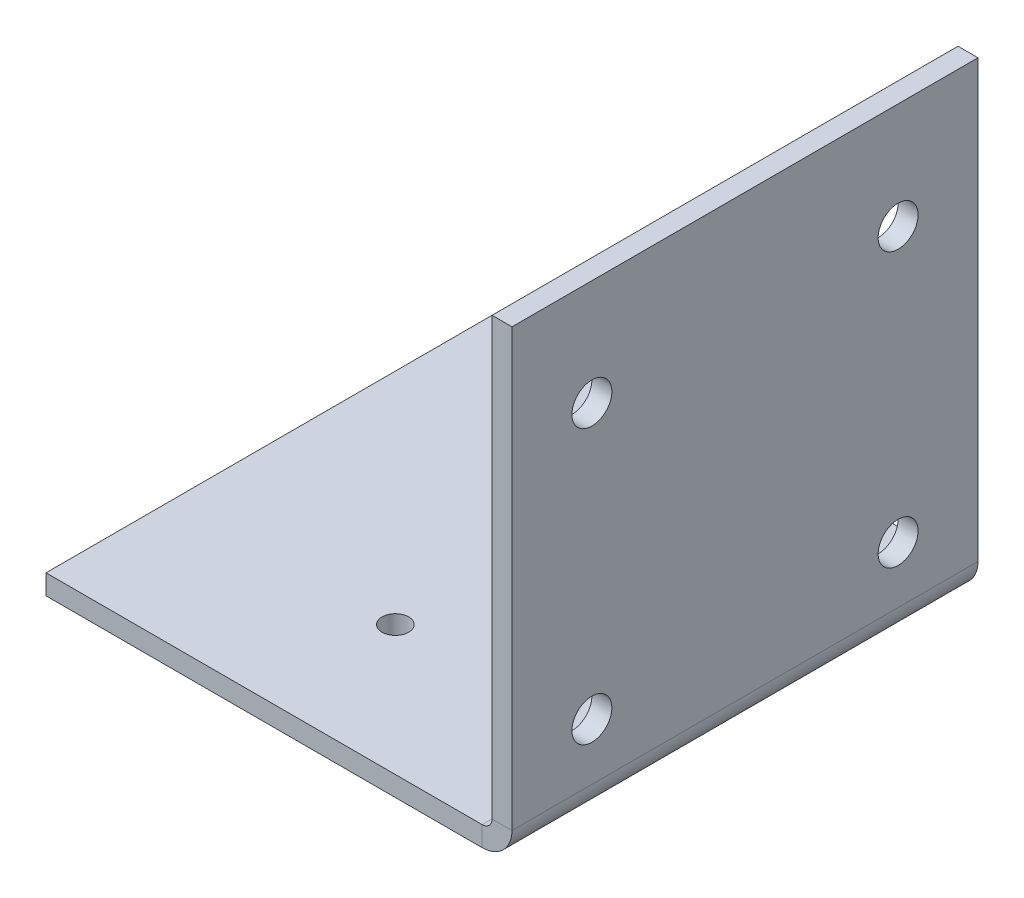
ISO-10303-21;
HEADER;
FILE_DESCRIPTION(('STEP AP214'),'2;1');
FILE_NAME('part.step','',(''),(''),'','','');
FILE_SCHEMA(('AUTOMOTIVE_DESIGN { 1 0 10303 214 1 1 1 1 }'));
ENDSEC;
DATA;
#1=APPLICATION_CONTEXT('core data for automotive mechanical design processes');
#2=APPLICATION_PROTOCOL_DEFINITION('international standard','automotive_design',2000,#1);
#3=PRODUCT_CONTEXT('',#1,'mechanical');
#4=PRODUCT('Part','Part','',(#3));
#5=PRODUCT_RELATED_PRODUCT_CATEGORY('part','',(#4));
#6=PRODUCT_DEFINITION_FORMATION('','',#4);
#7=PRODUCT_DEFINITION_CONTEXT('part definition',#1,'design');
#8=PRODUCT_DEFINITION('design','',#6,#7);
#9=PRODUCT_DEFINITION_SHAPE('','',#8);
#10=(LENGTH_UNIT() NAMED_UNIT(*) SI_UNIT(.MILLI.,.METRE.));
#11=(NAMED_UNIT(*) PLANE_ANGLE_UNIT() SI_UNIT($,.RADIAN.));
#12=(NAMED_UNIT(*) SI_UNIT($,.STERADIAN.) SOLID_ANGLE_UNIT());
#13=UNCERTAINTY_MEASURE_WITH_UNIT(LENGTH_MEASURE(1.E-05),#10,'distance_accuracy_value','');
#14=(GEOMETRIC_REPRESENTATION_CONTEXT(3) GLOBAL_UNCERTAINTY_ASSIGNED_CONTEXT((#13)) GLOBAL_UNIT_ASSIGNED_CONTEXT((#10,
#11,#12)) REPRESENTATION_CONTEXT('',''));
#15=CARTESIAN_POINT('',(0.,0.,0.));
#16=DIRECTION('',(0.,0.,1.));
#17=DIRECTION('',(1.,0.,0.));
#18=AXIS2_PLACEMENT_3D('',#15,#16,#17);
#19=CARTESIAN_POINT('',(-79.,13.600921455939,17.5));
#20=DIRECTION('',(0.,0.,-1.));
#21=DIRECTION('',(-1.,0.,0.));
#22=AXIS2_PLACEMENT_3D('',#19,#20,#21);
#23=PLANE('',#22);
#24=DIRECTION('',(0.,-1.,0.));
#25=VECTOR('',#24,1.);
#26=CARTESIAN_POINT('',(-81.2366,13.600921455939,17.5));
#27=LINE('',#26,#25);
#28=CARTESIAN_POINT('',(-81.2366,13.600921455939,17.5));
#29=VERTEX_POINT('',#28);
#30=CARTESIAN_POINT('',(-81.2366,12.100921455939,17.5));
#31=VERTEX_POINT('',#30);
#32=EDGE_CURVE('E115',#29,#31,#27,.T.);
#33=ORIENTED_EDGE('',*,*,#32,.F.);
#34=DIRECTION('',(1.,0.,0.));
#35=VECTOR('',#34,1.);
#36=CARTESIAN_POINT('',(-79.,13.600921455939,17.5));
#37=LINE('',#36,#35);
#38=CARTESIAN_POINT('',(-114.,13.600921455939,17.5));
#39=VERTEX_POINT('',#38);
#40=EDGE_CURVE('E121',#39,#29,#37,.T.);
#41=ORIENTED_EDGE('',*,*,#40,.F.);
#42=DIRECTION('',(0.,-1.,0.));
#43=VECTOR('',#42,1.);
#44=CARTESIAN_POINT('',(-114.,13.600921455939,17.5));
#45=LINE('',#44,#43);
#46=CARTESIAN_POINT('',(-114.,12.100921455939,17.5));
#47=VERTEX_POINT('',#46);
#48=EDGE_CURVE('E13',#39,#47,#45,.T.);
#49=ORIENTED_EDGE('',*,*,#48,.T.);
#50=DIRECTION('',(1.,0.,0.));
#51=VECTOR('',#50,1.);
#52=CARTESIAN_POINT('',(-79.,12.100921455939,17.5));
#53=LINE('',#52,#51);
#54=EDGE_CURVE('E107',#47,#31,#53,.T.);
#55=ORIENTED_EDGE('',*,*,#54,.T.);
#56=EDGE_LOOP('',(#33,#41,#49,#55));
#57=FACE_BOUND('',#56,.T.);
#58=ADVANCED_FACE('F59',(#57),#23,.F.);
#59=CARTESIAN_POINT('',(-79.,13.600921455939,-17.5));
#60=DIRECTION('',(0.,0.,1.));
#61=DIRECTION('',(1.,0.,0.));
#62=AXIS2_PLACEMENT_3D('',#59,#60,#61);
#63=PLANE('',#62);
#64=DIRECTION('',(0.,-1.,0.));
#65=VECTOR('',#64,1.);
#66=CARTESIAN_POINT('',(-81.2366,13.600921455939,-17.5));
#67=LINE('',#66,#65);
#68=CARTESIAN_POINT('',(-81.2366,13.600921455939,-17.5));
#69=VERTEX_POINT('',#68);
#70=CARTESIAN_POINT('',(-81.2366,12.100921455939,-17.5));
#71=VERTEX_POINT('',#70);
#72=EDGE_CURVE('E102',#69,#71,#67,.T.);
#73=ORIENTED_EDGE('',*,*,#72,.T.);
#74=DIRECTION('',(-1.,0.,0.));
#75=VECTOR('',#74,1.);
#76=CARTESIAN_POINT('',(-79.,12.100921455939,-17.5));
#77=LINE('',#76,#75);
#78=CARTESIAN_POINT('',(-114.,12.100921455939,-17.5));
#79=VERTEX_POINT('',#78);
#80=EDGE_CURVE('E97',#71,#79,#77,.T.);
#81=ORIENTED_EDGE('',*,*,#80,.T.);
#82=DIRECTION('',(0.,-1.,0.));
#83=VECTOR('',#82,1.);
#84=CARTESIAN_POINT('',(-114.,13.600921455939,-17.5));
#85=LINE('',#84,#83);
#86=CARTESIAN_POINT('',(-114.,13.600921455939,-17.5));
#87=VERTEX_POINT('',#86);
#88=EDGE_CURVE('E67',#87,#79,#85,.T.);
#89=ORIENTED_EDGE('',*,*,#88,.F.);
#90=DIRECTION('',(-1.,0.,0.));
#91=VECTOR('',#90,1.);
#92=CARTESIAN_POINT('',(-79.,13.600921455939,-17.5));
#93=LINE('',#92,#91);
#94=EDGE_CURVE('E83',#69,#87,#93,.T.);
#95=ORIENTED_EDGE('',*,*,#94,.F.);
#96=EDGE_LOOP('',(#73,#81,#89,#95));
#97=FACE_BOUND('',#96,.T.);
#98=ADVANCED_FACE('F99',(#97),#63,.F.);
#99=CARTESIAN_POINT('',(0.,13.600921455939,0.));
#100=DIRECTION('',(0.,-1.,0.));
#101=DIRECTION('',(0.,0.,-1.));
#102=AXIS2_PLACEMENT_3D('',#99,#100,#101);
#103=PLANE('',#102);
#104=CARTESIAN_POINT('',(-97.5126074749339,13.600921455939,-7.747));
#105=DIRECTION('',(0.,-1.,0.));
#106=DIRECTION('',(0.,0.,-1.));
#107=AXIS2_PLACEMENT_3D('',#104,#105,#106);
#108=CIRCLE('',#107,0.999999999999998);
#109=CARTESIAN_POINT('',(-97.5126074749339,13.600921455939,-8.747));
#110=VERTEX_POINT('',#109);
#111=EDGE_CURVE('E190',#110,#110,#108,.F.);
#112=ORIENTED_EDGE('',*,*,#111,.F.);
#113=EDGE_LOOP('',(#112));
#114=FACE_BOUND('',#113,.T.);
#115=CARTESIAN_POINT('',(-97.5126074749339,13.600921455939,7.747));
#116=DIRECTION('',(0.,-1.,0.));
#117=DIRECTION('',(0.,0.,-1.));
#118=AXIS2_PLACEMENT_3D('',#115,#116,#117);
#119=CIRCLE('',#118,0.999999999999998);
#120=CARTESIAN_POINT('',(-97.5126074749339,13.600921455939,6.747));
#121=VERTEX_POINT('',#120);
#122=EDGE_CURVE('E201',#121,#121,#119,.F.);
#123=ORIENTED_EDGE('',*,*,#122,.F.);
#124=EDGE_LOOP('',(#123));
#125=FACE_BOUND('',#124,.T.);
#126=DIRECTION('',(0.,0.,-1.));
#127=VECTOR('',#126,1.);
#128=CARTESIAN_POINT('',(-81.2366,13.600921455939,-17.5));
#129=LINE('',#128,#127);
#130=EDGE_CURVE('E129',#69,#29,#129,.F.);
#131=ORIENTED_EDGE('',*,*,#130,.F.);
#132=ORIENTED_EDGE('',*,*,#94,.T.);
#133=DIRECTION('',(0.,0.,1.));
#134=VECTOR('',#133,1.);
#135=CARTESIAN_POINT('',(-114.,13.600921455939,-17.5));
#136=LINE('',#135,#134);
#137=EDGE_CURVE('E106',#87,#39,#136,.T.);
#138=ORIENTED_EDGE('',*,*,#137,.T.);
#139=ORIENTED_EDGE('',*,*,#40,.T.);
#140=EDGE_LOOP('',(#131,#132,#138,#139));
#141=FACE_BOUND('',#140,.T.);
#142=ADVANCED_FACE('F218',(#114,#125,#141),#103,.F.);
#143=CARTESIAN_POINT('',(0.,12.100921455939,0.));
#144=DIRECTION('',(0.,-1.,0.));
#145=DIRECTION('',(0.,0.,-1.));
#146=AXIS2_PLACEMENT_3D('',#143,#144,#145);
#147=PLANE('',#146);
#148=CARTESIAN_POINT('',(-97.5126074749339,12.100921455939,-7.747));
#149=DIRECTION('',(0.,-1.,0.));
#150=DIRECTION('',(0.,0.,-1.));
#151=AXIS2_PLACEMENT_3D('',#148,#149,#150);
#152=CIRCLE('',#151,0.999999999999998);
#153=CARTESIAN_POINT('',(-97.5126074749339,12.100921455939,-8.747));
#154=VERTEX_POINT('',#153);
#155=EDGE_CURVE('E204',#154,#154,#152,.T.);
#156=ORIENTED_EDGE('',*,*,#155,.F.);
#157=EDGE_LOOP('',(#156));
#158=FACE_BOUND('',#157,.T.);
#159=CARTESIAN_POINT('',(-97.5126074749339,12.100921455939,7.747));
#160=DIRECTION('',(0.,-1.,0.));
#161=DIRECTION('',(0.,0.,-1.));
#162=AXIS2_PLACEMENT_3D('',#159,#160,#161);
#163=CIRCLE('',#162,0.999999999999998);
#164=CARTESIAN_POINT('',(-97.5126074749339,12.100921455939,6.747));
#165=VERTEX_POINT('',#164);
#166=EDGE_CURVE('E205',#165,#165,#163,.T.);
#167=ORIENTED_EDGE('',*,*,#166,.F.);
#168=EDGE_LOOP('',(#167));
#169=FACE_BOUND('',#168,.T.);
#170=ORIENTED_EDGE('',*,*,#80,.F.);
#171=DIRECTION('',(0.,0.,-1.));
#172=VECTOR('',#171,1.);
#173=CARTESIAN_POINT('',(-81.2366,12.100921455939,-17.5));
#174=LINE('',#173,#172);
#175=EDGE_CURVE('E139',#71,#31,#174,.F.);
#176=ORIENTED_EDGE('',*,*,#175,.T.);
#177=ORIENTED_EDGE('',*,*,#54,.F.);
#178=DIRECTION('',(0.,0.,1.));
#179=VECTOR('',#178,1.);
#180=CARTESIAN_POINT('',(-114.,12.100921455939,-17.5));
#181=LINE('',#180,#179);
#182=EDGE_CURVE('E112',#79,#47,#181,.T.);
#183=ORIENTED_EDGE('',*,*,#182,.F.);
#184=EDGE_LOOP('',(#170,#176,#177,#183));
#185=FACE_BOUND('',#184,.T.);
#186=ADVANCED_FACE('F113',(#158,#169,#185),#147,.T.);
#187=CARTESIAN_POINT('',(-114.,13.600921455939,-17.5));
#188=DIRECTION('',(1.,0.,0.));
#189=DIRECTION('',(0.,0.,-1.));
#190=AXIS2_PLACEMENT_3D('',#187,#188,#189);
#191=PLANE('',#190);
#192=ORIENTED_EDGE('',*,*,#182,.T.);
#193=ORIENTED_EDGE('',*,*,#48,.F.);
#194=ORIENTED_EDGE('',*,*,#137,.F.);
#195=ORIENTED_EDGE('',*,*,#88,.T.);
#196=EDGE_LOOP('',(#192,#193,#194,#195));
#197=FACE_BOUND('',#196,.T.);
#198=ADVANCED_FACE('F61',(#197),#191,.F.);
#199=CARTESIAN_POINT('',(-81.2366,14.337521455939,17.5));
#200=DIRECTION('',(0.,0.,1.));
#201=DIRECTION('',(1.,0.,0.));
#202=AXIS2_PLACEMENT_3D('',#199,#200,#201);
#203=PLANE('',#202);
#204=DIRECTION('',(-1.,0.,0.));
#205=VECTOR('',#204,1.);
#206=CARTESIAN_POINT('',(-79.,14.337521455939,17.5));
#207=LINE('',#206,#205);
#208=CARTESIAN_POINT('',(-80.5,14.337521455939,17.5));
#209=VERTEX_POINT('',#208);
#210=CARTESIAN_POINT('',(-79.,14.337521455939,17.5));
#211=VERTEX_POINT('',#210);
#212=EDGE_CURVE('E142',#209,#211,#207,.F.);
#213=ORIENTED_EDGE('',*,*,#212,.F.);
#214=CARTESIAN_POINT('',(-81.2366,14.337521455939,17.5));
#215=DIRECTION('',(0.,0.,-1.));
#216=DIRECTION('',(-1.,0.,0.));
#217=AXIS2_PLACEMENT_3D('',#214,#215,#216);
#218=CIRCLE('',#217,0.736600000000004);
#219=EDGE_CURVE('E133',#29,#209,#218,.F.);
#220=ORIENTED_EDGE('',*,*,#219,.F.);
#221=ORIENTED_EDGE('',*,*,#32,.T.);
#222=CARTESIAN_POINT('',(-81.2366,14.337521455939,17.5));
#223=DIRECTION('',(0.,0.,-1.));
#224=DIRECTION('',(-1.,0.,0.));
#225=AXIS2_PLACEMENT_3D('',#222,#223,#224);
#226=CIRCLE('',#225,2.2366);
#227=EDGE_CURVE('E74',#31,#211,#226,.F.);
#228=ORIENTED_EDGE('',*,*,#227,.T.);
#229=EDGE_LOOP('',(#213,#220,#221,#228));
#230=FACE_BOUND('',#229,.T.);
#231=ADVANCED_FACE('F247',(#230),#203,.T.);
#232=CARTESIAN_POINT('',(-81.2366,14.337521455939,-17.5));
#233=DIRECTION('',(0.,0.,1.));
#234=DIRECTION('',(1.,0.,0.));
#235=AXIS2_PLACEMENT_3D('',#232,#233,#234);
#236=PLANE('',#235);
#237=CARTESIAN_POINT('',(-81.2366,14.337521455939,-17.5));
#238=DIRECTION('',(0.,0.,-1.));
#239=DIRECTION('',(-1.,0.,0.));
#240=AXIS2_PLACEMENT_3D('',#237,#238,#239);
#241=CIRCLE('',#240,0.736600000000004);
#242=CARTESIAN_POINT('',(-80.5,14.337521455939,-17.5));
#243=VERTEX_POINT('',#242);
#244=EDGE_CURVE('E126',#243,#69,#241,.T.);
#245=ORIENTED_EDGE('',*,*,#244,.F.);
#246=DIRECTION('',(-1.,0.,0.));
#247=VECTOR('',#246,1.);
#248=CARTESIAN_POINT('',(-80.5,14.337521455939,-17.5));
#249=LINE('',#248,#247);
#250=CARTESIAN_POINT('',(-79.,14.337521455939,-17.5));
#251=VERTEX_POINT('',#250);
#252=EDGE_CURVE('E149',#243,#251,#249,.F.);
#253=ORIENTED_EDGE('',*,*,#252,.T.);
#254=CARTESIAN_POINT('',(-81.2366,14.337521455939,-17.5));
#255=DIRECTION('',(0.,0.,-1.));
#256=DIRECTION('',(-1.,0.,0.));
#257=AXIS2_PLACEMENT_3D('',#254,#255,#256);
#258=CIRCLE('',#257,2.2366);
#259=EDGE_CURVE('E136',#251,#71,#258,.T.);
#260=ORIENTED_EDGE('',*,*,#259,.T.);
#261=ORIENTED_EDGE('',*,*,#72,.F.);
#262=EDGE_LOOP('',(#245,#253,#260,#261));
#263=FACE_BOUND('',#262,.T.);
#264=ADVANCED_FACE('F255',(#263),#236,.F.);
#265=CARTESIAN_POINT('',(-81.2366,14.337521455939,-17.5));
#266=DIRECTION('',(0.,0.,-1.));
#267=DIRECTION('',(1.,0.,0.));
#268=AXIS2_PLACEMENT_3D('',#265,#266,#267);
#269=CYLINDRICAL_SURFACE('',#268,2.2366);
#270=ORIENTED_EDGE('',*,*,#175,.F.);
#271=ORIENTED_EDGE('',*,*,#259,.F.);
#272=DIRECTION('',(0.,0.,-1.));
#273=VECTOR('',#272,1.);
#274=CARTESIAN_POINT('',(-79.,14.337521455939,17.5));
#275=LINE('',#274,#273);
#276=EDGE_CURVE('E152',#251,#211,#275,.F.);
#277=ORIENTED_EDGE('',*,*,#276,.T.);
#278=ORIENTED_EDGE('',*,*,#227,.F.);
#279=EDGE_LOOP('',(#270,#271,#277,#278));
#280=FACE_BOUND('',#279,.T.);
#281=ADVANCED_FACE('F258',(#280),#269,.T.);
#282=CARTESIAN_POINT('',(-81.2366,14.337521455939,-17.5));
#283=DIRECTION('',(0.,0.,-1.));
#284=DIRECTION('',(1.,0.,0.));
#285=AXIS2_PLACEMENT_3D('',#282,#283,#284);
#286=CYLINDRICAL_SURFACE('',#285,0.736600000000004);
#287=ORIENTED_EDGE('',*,*,#130,.T.);
#288=ORIENTED_EDGE('',*,*,#219,.T.);
#289=DIRECTION('',(0.,0.,-1.));
#290=VECTOR('',#289,1.);
#291=CARTESIAN_POINT('',(-80.5,14.337521455939,17.5));
#292=LINE('',#291,#290);
#293=EDGE_CURVE('E145',#209,#243,#292,.T.);
#294=ORIENTED_EDGE('',*,*,#293,.T.);
#295=ORIENTED_EDGE('',*,*,#244,.T.);
#296=EDGE_LOOP('',(#287,#288,#294,#295));
#297=FACE_BOUND('',#296,.T.);
#298=ADVANCED_FACE('F238',(#297),#286,.F.);
#299=CARTESIAN_POINT('',(-78.9999999999999,47.100921455939,-17.5));
#300=DIRECTION('',(0.,0.,1.));
#301=DIRECTION('',(1.,0.,0.));
#302=AXIS2_PLACEMENT_3D('',#299,#300,#301);
#303=PLANE('',#302);
#304=ORIENTED_EDGE('',*,*,#252,.F.);
#305=DIRECTION('',(0.,-1.,0.));
#306=VECTOR('',#305,1.);
#307=CARTESIAN_POINT('',(-80.4999999999999,47.100921455939,-17.5));
#308=LINE('',#307,#306);
#309=CARTESIAN_POINT('',(-80.4999999999999,47.100921455939,-17.5));
#310=VERTEX_POINT('',#309);
#311=EDGE_CURVE('E154',#243,#310,#308,.F.);
#312=ORIENTED_EDGE('',*,*,#311,.T.);
#313=DIRECTION('',(-1.,0.,0.));
#314=VECTOR('',#313,1.);
#315=CARTESIAN_POINT('',(-78.9999999999999,47.100921455939,-17.5));
#316=LINE('',#315,#314);
#317=CARTESIAN_POINT('',(-78.9999999999999,47.100921455939,-17.5));
#318=VERTEX_POINT('',#317);
#319=EDGE_CURVE('E130',#318,#310,#316,.T.);
#320=ORIENTED_EDGE('',*,*,#319,.F.);
#321=DIRECTION('',(0.,1.,0.));
#322=VECTOR('',#321,1.);
#323=CARTESIAN_POINT('',(-79.,2.56576565888414E-13,-17.5));
#324=LINE('',#323,#322);
#325=EDGE_CURVE('E163',#251,#318,#324,.T.);
#326=ORIENTED_EDGE('',*,*,#325,.F.);
#327=EDGE_LOOP('',(#304,#312,#320,#326));
#328=FACE_BOUND('',#327,.T.);
#329=ADVANCED_FACE('F264',(#328),#303,.F.);
#330=CARTESIAN_POINT('',(-79.,13.600921455939,17.5));
#331=DIRECTION('',(0.,0.,-1.));
#332=DIRECTION('',(-1.,0.,0.));
#333=AXIS2_PLACEMENT_3D('',#330,#331,#332);
#334=PLANE('',#333);
#335=ORIENTED_EDGE('',*,*,#212,.T.);
#336=DIRECTION('',(0.,-1.,0.));
#337=VECTOR('',#336,1.);
#338=CARTESIAN_POINT('',(-79.,2.56576565888414E-13,17.5));
#339=LINE('',#338,#337);
#340=CARTESIAN_POINT('',(-78.9999999999999,47.100921455939,17.5));
#341=VERTEX_POINT('',#340);
#342=EDGE_CURVE('E169',#341,#211,#339,.T.);
#343=ORIENTED_EDGE('',*,*,#342,.F.);
#344=DIRECTION('',(-1.,0.,0.));
#345=VECTOR('',#344,1.);
#346=CARTESIAN_POINT('',(-78.9999999999999,47.100921455939,17.5));
#347=LINE('',#346,#345);
#348=CARTESIAN_POINT('',(-80.4999999999999,47.100921455939,17.5));
#349=VERTEX_POINT('',#348);
#350=EDGE_CURVE('E172',#341,#349,#347,.T.);
#351=ORIENTED_EDGE('',*,*,#350,.T.);
#352=DIRECTION('',(0.,1.,0.));
#353=VECTOR('',#352,1.);
#354=CARTESIAN_POINT('',(-80.5,13.600921455939,17.5));
#355=LINE('',#354,#353);
#356=EDGE_CURVE('E160',#349,#209,#355,.F.);
#357=ORIENTED_EDGE('',*,*,#356,.T.);
#358=EDGE_LOOP('',(#335,#343,#351,#357));
#359=FACE_BOUND('',#358,.T.);
#360=ADVANCED_FACE('F269',(#359),#334,.F.);
#361=CARTESIAN_POINT('',(-79.,2.56576565888414E-13,0.));
#362=DIRECTION('',(-1.,0.,0.));
#363=DIRECTION('',(0.,-1.,0.));
#364=AXIS2_PLACEMENT_3D('',#361,#362,#363);
#365=PLANE('',#364);
#366=CARTESIAN_POINT('',(-79.,18.5789021772819,-11.5));
#367=DIRECTION('',(-1.,0.,0.));
#368=DIRECTION('',(0.,-1.,0.));
#369=AXIS2_PLACEMENT_3D('',#366,#367,#368);
#370=CIRCLE('',#369,1.5);
#371=CARTESIAN_POINT('',(-79.,17.0789021772819,-11.5));
#372=VERTEX_POINT('',#371);
#373=EDGE_CURVE('E183',#372,#372,#370,.F.);
#374=ORIENTED_EDGE('',*,*,#373,.F.);
#375=EDGE_LOOP('',(#374));
#376=FACE_BOUND('',#375,.T.);
#377=CARTESIAN_POINT('',(-79.,18.5789021772819,11.5));
#378=DIRECTION('',(-1.,0.,0.));
#379=DIRECTION('',(0.,-1.,0.));
#380=AXIS2_PLACEMENT_3D('',#377,#378,#379);
#381=CIRCLE('',#380,1.5);
#382=CARTESIAN_POINT('',(-79.,17.0789021772819,11.5));
#383=VERTEX_POINT('',#382);
#384=EDGE_CURVE('E191',#383,#383,#381,.F.);
#385=ORIENTED_EDGE('',*,*,#384,.F.);
#386=EDGE_LOOP('',(#385));
#387=FACE_BOUND('',#386,.T.);
#388=CARTESIAN_POINT('',(-78.9999999999999,39.1450000000001,11.5));
#389=DIRECTION('',(-1.,0.,0.));
#390=DIRECTION('',(0.,-1.,0.));
#391=AXIS2_PLACEMENT_3D('',#388,#389,#390);
#392=CIRCLE('',#391,1.5);
#393=CARTESIAN_POINT('',(-78.9999999999999,37.6450000000001,11.5));
#394=VERTEX_POINT('',#393);
#395=EDGE_CURVE('E182',#394,#394,#392,.F.);
#396=ORIENTED_EDGE('',*,*,#395,.F.);
#397=EDGE_LOOP('',(#396));
#398=FACE_BOUND('',#397,.T.);
#399=CARTESIAN_POINT('',(-78.9999999999999,39.1450000000001,-11.5));
#400=DIRECTION('',(-1.,0.,0.));
#401=DIRECTION('',(0.,-1.,0.));
#402=AXIS2_PLACEMENT_3D('',#399,#400,#401);
#403=CIRCLE('',#402,1.5);
#404=CARTESIAN_POINT('',(-78.9999999999999,37.6450000000001,-11.5));
#405=VERTEX_POINT('',#404);
#406=EDGE_CURVE('E146',#405,#405,#403,.F.);
#407=ORIENTED_EDGE('',*,*,#406,.F.);
#408=EDGE_LOOP('',(#407));
#409=FACE_BOUND('',#408,.T.);
#410=ORIENTED_EDGE('',*,*,#276,.F.);
#411=ORIENTED_EDGE('',*,*,#325,.T.);
#412=DIRECTION('',(0.,0.,1.));
#413=VECTOR('',#412,1.);
#414=CARTESIAN_POINT('',(-78.9999999999999,47.100921455939,0.));
#415=LINE('',#414,#413);
#416=EDGE_CURVE('E166',#318,#341,#415,.T.);
#417=ORIENTED_EDGE('',*,*,#416,.T.);
#418=ORIENTED_EDGE('',*,*,#342,.T.);
#419=EDGE_LOOP('',(#410,#411,#417,#418));
#420=FACE_BOUND('',#419,.T.);
#421=ADVANCED_FACE('F279',(#376,#387,#398,#409,#420),#365,.F.);
#422=CARTESIAN_POINT('',(-80.5,2.61813787896679E-13,0.));
#423=DIRECTION('',(-1.,0.,0.));
#424=DIRECTION('',(0.,-1.,0.));
#425=AXIS2_PLACEMENT_3D('',#422,#423,#424);
#426=PLANE('',#425);
#427=CARTESIAN_POINT('',(-80.5,18.5789021772819,-11.5));
#428=DIRECTION('',(-1.,0.,0.));
#429=DIRECTION('',(0.,1.,0.));
#430=AXIS2_PLACEMENT_3D('',#427,#428,#429);
#431=CIRCLE('',#430,1.5);
#432=CARTESIAN_POINT('',(-80.5,20.0789021772819,-11.5));
#433=VERTEX_POINT('',#432);
#434=EDGE_CURVE('E187',#433,#433,#431,.T.);
#435=ORIENTED_EDGE('',*,*,#434,.F.);
#436=EDGE_LOOP('',(#435));
#437=FACE_BOUND('',#436,.T.);
#438=CARTESIAN_POINT('',(-80.5,18.5789021772819,11.5));
#439=DIRECTION('',(-1.,0.,0.));
#440=DIRECTION('',(0.,-1.,0.));
#441=AXIS2_PLACEMENT_3D('',#438,#439,#440);
#442=CIRCLE('',#441,1.5);
#443=CARTESIAN_POINT('',(-80.5,17.0789021772819,11.5));
#444=VERTEX_POINT('',#443);
#445=EDGE_CURVE('E186',#444,#444,#442,.T.);
#446=ORIENTED_EDGE('',*,*,#445,.F.);
#447=EDGE_LOOP('',(#446));
#448=FACE_BOUND('',#447,.T.);
#449=CARTESIAN_POINT('',(-80.4999999999999,39.1450000000001,11.5));
#450=DIRECTION('',(-1.,0.,0.));
#451=DIRECTION('',(0.,1.,0.));
#452=AXIS2_PLACEMENT_3D('',#449,#450,#451);
#453=CIRCLE('',#452,1.5);
#454=CARTESIAN_POINT('',(-80.4999999999999,40.6450000000001,11.5));
#455=VERTEX_POINT('',#454);
#456=EDGE_CURVE('E194',#455,#455,#453,.T.);
#457=ORIENTED_EDGE('',*,*,#456,.F.);
#458=EDGE_LOOP('',(#457));
#459=FACE_BOUND('',#458,.T.);
#460=CARTESIAN_POINT('',(-80.4999999999999,39.1450000000001,-11.5));
#461=DIRECTION('',(-1.,0.,0.));
#462=DIRECTION('',(0.,-1.,0.));
#463=AXIS2_PLACEMENT_3D('',#460,#461,#462);
#464=CIRCLE('',#463,1.5);
#465=CARTESIAN_POINT('',(-80.4999999999999,37.6450000000001,-11.5));
#466=VERTEX_POINT('',#465);
#467=EDGE_CURVE('E179',#466,#466,#464,.T.);
#468=ORIENTED_EDGE('',*,*,#467,.F.);
#469=EDGE_LOOP('',(#468));
#470=FACE_BOUND('',#469,.T.);
#471=ORIENTED_EDGE('',*,*,#311,.F.);
#472=ORIENTED_EDGE('',*,*,#293,.F.);
#473=ORIENTED_EDGE('',*,*,#356,.F.);
#474=DIRECTION('',(0.,0.,-1.));
#475=VECTOR('',#474,1.);
#476=CARTESIAN_POINT('',(-80.4999999999999,47.100921455939,17.5));
#477=LINE('',#476,#475);
#478=EDGE_CURVE('E157',#310,#349,#477,.F.);
#479=ORIENTED_EDGE('',*,*,#478,.F.);
#480=EDGE_LOOP('',(#471,#472,#473,#479));
#481=FACE_BOUND('',#480,.T.);
#482=ADVANCED_FACE('F275',(#437,#448,#459,#470,#481),#426,.T.);
#483=CARTESIAN_POINT('',(-78.9999999999999,47.100921455939,17.5));
#484=DIRECTION('',(0.,-1.,0.));
#485=DIRECTION('',(1.,0.,0.));
#486=AXIS2_PLACEMENT_3D('',#483,#484,#485);
#487=PLANE('',#486);
#488=ORIENTED_EDGE('',*,*,#478,.T.);
#489=ORIENTED_EDGE('',*,*,#350,.F.);
#490=ORIENTED_EDGE('',*,*,#416,.F.);
#491=ORIENTED_EDGE('',*,*,#319,.T.);
#492=EDGE_LOOP('',(#488,#489,#490,#491));
#493=FACE_BOUND('',#492,.T.);
#494=ADVANCED_FACE('F271',(#493),#487,.F.);
#495=CARTESIAN_POINT('',(-78.9989999999998,39.1450000000001,-11.5));
#496=DIRECTION('',(-1.,0.,0.));
#497=DIRECTION('',(0.,-1.,0.));
#498=AXIS2_PLACEMENT_3D('',#495,#496,#497);
#499=CYLINDRICAL_SURFACE('',#498,1.5);
#500=ORIENTED_EDGE('',*,*,#467,.T.);
#501=EDGE_LOOP('',(#500));
#502=FACE_BOUND('',#501,.T.);
#503=ORIENTED_EDGE('',*,*,#406,.T.);
#504=EDGE_LOOP('',(#503));
#505=FACE_BOUND('',#504,.T.);
#506=ADVANCED_FACE('F274',(#502,#505),#499,.F.);
#507=CARTESIAN_POINT('',(-78.9989999999998,39.1450000000001,11.5));
#508=DIRECTION('',(-1.,0.,0.));
#509=DIRECTION('',(0.,-1.,0.));
#510=AXIS2_PLACEMENT_3D('',#507,#508,#509);
#511=CYLINDRICAL_SURFACE('',#510,1.5);
#512=ORIENTED_EDGE('',*,*,#456,.T.);
#513=EDGE_LOOP('',(#512));
#514=FACE_BOUND('',#513,.T.);
#515=ORIENTED_EDGE('',*,*,#395,.T.);
#516=EDGE_LOOP('',(#515));
#517=FACE_BOUND('',#516,.T.);
#518=ADVANCED_FACE('F289',(#514,#517),#511,.F.);
#519=CARTESIAN_POINT('',(-78.9989999999999,18.5789021772819,11.5));
#520=DIRECTION('',(-1.,0.,0.));
#521=DIRECTION('',(0.,-1.,0.));
#522=AXIS2_PLACEMENT_3D('',#519,#520,#521);
#523=CYLINDRICAL_SURFACE('',#522,1.5);
#524=ORIENTED_EDGE('',*,*,#445,.T.);
#525=EDGE_LOOP('',(#524));
#526=FACE_BOUND('',#525,.T.);
#527=ORIENTED_EDGE('',*,*,#384,.T.);
#528=EDGE_LOOP('',(#527));
#529=FACE_BOUND('',#528,.T.);
#530=ADVANCED_FACE('F293',(#526,#529),#523,.F.);
#531=CARTESIAN_POINT('',(-78.9989999999999,18.5789021772819,-11.5));
#532=DIRECTION('',(-1.,0.,0.));
#533=DIRECTION('',(0.,-1.,0.));
#534=AXIS2_PLACEMENT_3D('',#531,#532,#533);
#535=CYLINDRICAL_SURFACE('',#534,1.5);
#536=ORIENTED_EDGE('',*,*,#434,.T.);
#537=EDGE_LOOP('',(#536));
#538=FACE_BOUND('',#537,.T.);
#539=ORIENTED_EDGE('',*,*,#373,.T.);
#540=EDGE_LOOP('',(#539));
#541=FACE_BOUND('',#540,.T.);
#542=ADVANCED_FACE('F225',(#538,#541),#535,.F.);
#543=CARTESIAN_POINT('',(-97.5126074749339,47.101921455939,7.747));
#544=DIRECTION('',(0.,-1.,0.));
#545=DIRECTION('',(0.,0.,-1.));
#546=AXIS2_PLACEMENT_3D('',#543,#544,#545);
#547=CYLINDRICAL_SURFACE('',#546,0.999999999999998);
#548=ORIENTED_EDGE('',*,*,#166,.T.);
#549=EDGE_LOOP('',(#548));
#550=FACE_BOUND('',#549,.T.);
#551=ORIENTED_EDGE('',*,*,#122,.T.);
#552=EDGE_LOOP('',(#551));
#553=FACE_BOUND('',#552,.T.);
#554=ADVANCED_FACE('F222',(#550,#553),#547,.F.);
#555=CARTESIAN_POINT('',(-97.5126074749339,47.101921455939,-7.747));
#556=DIRECTION('',(0.,-1.,0.));
#557=DIRECTION('',(0.,0.,-1.));
#558=AXIS2_PLACEMENT_3D('',#555,#556,#557);
#559=CYLINDRICAL_SURFACE('',#558,0.999999999999998);
#560=ORIENTED_EDGE('',*,*,#155,.T.);
#561=EDGE_LOOP('',(#560));
#562=FACE_BOUND('',#561,.T.);
#563=ORIENTED_EDGE('',*,*,#111,.T.);
#564=EDGE_LOOP('',(#563));
#565=FACE_BOUND('',#564,.T.);
#566=ADVANCED_FACE('F213',(#562,#565),#559,.F.);
#567=CLOSED_SHELL('',(#58,#98,#142,#186,#198,#231,#264,#281,#298,#329,#360,#421,#482,#494,#506,
#518,#530,#542,#554,#566));
#568=MANIFOLD_SOLID_BREP('B2',#567);
#569=ADVANCED_BREP_SHAPE_REPRESENTATION('',(#18,#568),#14);
#570=SHAPE_DEFINITION_REPRESENTATION(#9,#569);
ENDSEC;
END-ISO-10303-21;
